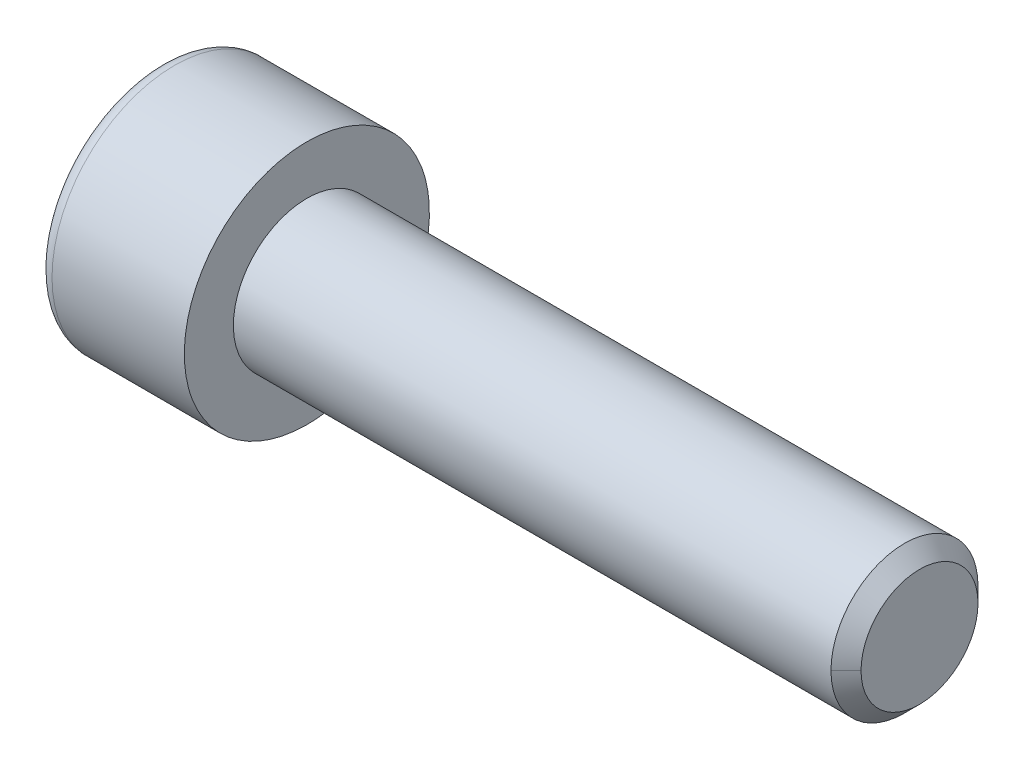
ISO-10303-21;
HEADER;
FILE_DESCRIPTION(('STEP AP214'),'2;1');
FILE_NAME('part.step','',(''),(''),'','','');
FILE_SCHEMA(('AUTOMOTIVE_DESIGN { 1 0 10303 214 1 1 1 1 }'));
ENDSEC;
DATA;
#1=APPLICATION_CONTEXT('core data for automotive mechanical design processes');
#2=APPLICATION_PROTOCOL_DEFINITION('international standard','automotive_design',2000,#1);
#3=PRODUCT_CONTEXT('',#1,'mechanical');
#4=PRODUCT('Part','Part','',(#3));
#5=PRODUCT_RELATED_PRODUCT_CATEGORY('part','',(#4));
#6=PRODUCT_DEFINITION_FORMATION('','',#4);
#7=PRODUCT_DEFINITION_CONTEXT('part definition',#1,'design');
#8=PRODUCT_DEFINITION('design','',#6,#7);
#9=PRODUCT_DEFINITION_SHAPE('','',#8);
#10=(LENGTH_UNIT() NAMED_UNIT(*) SI_UNIT(.MILLI.,.METRE.));
#11=(NAMED_UNIT(*) PLANE_ANGLE_UNIT() SI_UNIT($,.RADIAN.));
#12=(NAMED_UNIT(*) SI_UNIT($,.STERADIAN.) SOLID_ANGLE_UNIT());
#13=UNCERTAINTY_MEASURE_WITH_UNIT(LENGTH_MEASURE(1.E-05),#10,'distance_accuracy_value','');
#14=(GEOMETRIC_REPRESENTATION_CONTEXT(3) GLOBAL_UNCERTAINTY_ASSIGNED_CONTEXT((#13)) GLOBAL_UNIT_ASSIGNED_CONTEXT((#10,
#11,#12)) REPRESENTATION_CONTEXT('',''));
#15=CARTESIAN_POINT('',(0.,0.,0.));
#16=DIRECTION('',(0.,0.,1.));
#17=DIRECTION('',(1.,0.,0.));
#18=AXIS2_PLACEMENT_3D('',#15,#16,#17);
#19=CARTESIAN_POINT('',(25.,-2.4151886,2.4151886));
#20=DIRECTION('',(1.,0.,0.));
#21=DIRECTION('',(0.,1.,0.));
#22=AXIS2_PLACEMENT_3D('',#19,#20,#21);
#23=PLANE('',#22);
#24=CARTESIAN_POINT('',(25.,0.,0.));
#25=DIRECTION('',(1.,0.,0.));
#26=DIRECTION('',(0.,0.,-1.));
#27=AXIS2_PLACEMENT_3D('',#24,#25,#26);
#28=CIRCLE('',#27,2.38655);
#29=CARTESIAN_POINT('',(25.,-8.15815978925537E-10,2.38654999999999));
#30=VERTEX_POINT('',#29);
#31=CARTESIAN_POINT('',(25.,-2.85727898792687E-10,-2.38654999999999));
#32=VERTEX_POINT('',#31);
#33=EDGE_CURVE('E128',#30,#32,#28,.F.);
#34=ORIENTED_EDGE('',*,*,#33,.F.);
#35=CARTESIAN_POINT('',(25.,0.,0.));
#36=DIRECTION('',(1.,0.,0.));
#37=DIRECTION('',(0.,0.,-1.));
#38=AXIS2_PLACEMENT_3D('',#35,#36,#37);
#39=CIRCLE('',#38,2.38655);
#40=EDGE_CURVE('E57',#32,#30,#39,.F.);
#41=ORIENTED_EDGE('',*,*,#40,.F.);
#42=EDGE_LOOP('',(#34,#41));
#43=FACE_BOUND('',#42,.T.);
#44=ADVANCED_FACE('F53',(#43),#23,.T.);
#45=CARTESIAN_POINT('',(25.,0.,-2.38655));
#46=CARTESIAN_POINT('',(24.38655,0.,-3.));
#47=(BOUNDED_CURVE() B_SPLINE_CURVE(1,(#45,#46),.UNSPECIFIED.,.F.,
.F.) B_SPLINE_CURVE_WITH_KNOTS((2,2),(0.,1.00000000000009),
.UNSPECIFIED.) CURVE() GEOMETRIC_REPRESENTATION_ITEM() RATIONAL_B_SPLINE_CURVE((1.,1.)) REPRESENTATION_ITEM(''));
#48=CARTESIAN_POINT('',(1024.38655,0.,0.));
#49=DIRECTION('',(-1.,0.,0.));
#50=AXIS1_PLACEMENT('',#48,#49);
#51=SURFACE_OF_REVOLUTION('',#47,#50);
#52=ORIENTED_EDGE('',*,*,#40,.T.);
#53=DIRECTION('',(0.707106781186548,2.90060050295602E-10,-0.707106781186547));
#54=VECTOR('',#53,1.);
#55=CARTESIAN_POINT('',(24.693275,-1.10479987286926E-09,2.693275));
#56=LINE('',#55,#54);
#57=CARTESIAN_POINT('',(24.38655,-1.23062057109199E-09,3.));
#58=VERTEX_POINT('',#57);
#59=EDGE_CURVE('E125',#58,#30,#56,.T.);
#60=ORIENTED_EDGE('',*,*,#59,.F.);
#61=CARTESIAN_POINT('',(24.38655,0.,0.));
#62=DIRECTION('',(1.,0.,0.));
#63=DIRECTION('',(0.,0.,-1.));
#64=AXIS2_PLACEMENT_3D('',#61,#62,#63);
#65=CIRCLE('',#64,3.);
#66=CARTESIAN_POINT('',(24.38655,-2.69379553018569E-10,-3.));
#67=VERTEX_POINT('',#66);
#68=EDGE_CURVE('E134',#67,#58,#65,.F.);
#69=ORIENTED_EDGE('',*,*,#68,.F.);
#70=DIRECTION('',(-0.707106781186548,-1.26986739101621E-10,-0.707106781186547));
#71=VECTOR('',#70,1.);
#72=CARTESIAN_POINT('',(24.693275,-4.83675477104059E-10,-2.693275));
#73=LINE('',#72,#71);
#74=EDGE_CURVE('E119',#32,#67,#73,.T.);
#75=ORIENTED_EDGE('',*,*,#74,.F.);
#76=EDGE_LOOP('',(#52,#60,#69,#75));
#77=FACE_BOUND('',#76,.T.);
#78=ADVANCED_FACE('F132',(#77),#51,.T.);
#79=CARTESIAN_POINT('',(25.0001414213562,0.,-2.38640857864376));
#80=CARTESIAN_POINT('',(25.,0.,-2.38655));
#81=CARTESIAN_POINT('',(24.38655,0.,-3.));
#82=(BOUNDED_CURVE() B_SPLINE_CURVE(1,(#79,#80,#81),.UNSPECIFIED.,.F.,
.F.) B_SPLINE_CURVE_WITH_KNOTS((2,1,2),(-0.000230534409542768,3.70006775601133E-11,1.),
.UNSPECIFIED.) CURVE() GEOMETRIC_REPRESENTATION_ITEM() RATIONAL_B_SPLINE_CURVE((1.,1.,1.)) REPRESENTATION_ITEM(''));
#83=CARTESIAN_POINT('',(1024.38655,0.,0.));
#84=DIRECTION('',(-1.,0.,0.));
#85=AXIS1_PLACEMENT('',#83,#84);
#86=SURFACE_OF_REVOLUTION('',#82,#85);
#87=ORIENTED_EDGE('',*,*,#59,.T.);
#88=ORIENTED_EDGE('',*,*,#33,.T.);
#89=ORIENTED_EDGE('',*,*,#74,.T.);
#90=CARTESIAN_POINT('',(24.38655,0.,0.));
#91=DIRECTION('',(1.,0.,0.));
#92=DIRECTION('',(0.,0.,-1.));
#93=AXIS2_PLACEMENT_3D('',#90,#91,#92);
#94=CIRCLE('',#93,3.);
#95=EDGE_CURVE('E129',#58,#67,#94,.F.);
#96=ORIENTED_EDGE('',*,*,#95,.F.);
#97=EDGE_LOOP('',(#87,#88,#89,#96));
#98=FACE_BOUND('',#97,.T.);
#99=ADVANCED_FACE('F126',(#98),#86,.T.);
#100=CARTESIAN_POINT('',(-1.333333333,0.,0.));
#101=CARTESIAN_POINT('',(-3.01,0.,-2.904071854));
#102=(BOUNDED_CURVE() B_SPLINE_CURVE(1,(#100,#101),.UNSPECIFIED.,.F.,
.F.) B_SPLINE_CURVE_WITH_KNOTS((2,2),(0.,1.),
.UNSPECIFIED.) CURVE() GEOMETRIC_REPRESENTATION_ITEM() RATIONAL_B_SPLINE_CURVE((1.,1.)) REPRESENTATION_ITEM(''));
#103=CARTESIAN_POINT('',(996.99,0.,0.));
#104=DIRECTION('',(-1.,0.,0.));
#105=AXIS1_PLACEMENT('',#103,#104);
#106=SURFACE_OF_REVOLUTION('',#102,#105);
#107=CARTESIAN_POINT('',(-1.333333333,0.,0.));
#108=VERTEX_POINT('',#107);
#109=VERTEX_LOOP('',#108);
#110=FACE_BOUND('',#109,.T.);
#111=CARTESIAN_POINT('',(-2.99999999990194,-2.5,1.44337567259391));
#112=CARTESIAN_POINT('',(-2.98209574263693,-2.5,1.38134905294953));
#113=CARTESIAN_POINT('',(-2.96498591501795,-2.5,1.31908524854831));
#114=CARTESIAN_POINT('',(-2.9325586063815,-2.5,1.19402341340579));
#115=CARTESIAN_POINT('',(-2.91724304001177,-2.5,1.13122488732653));
#116=CARTESIAN_POINT('',(-2.88864230481174,-2.5,1.00514627159482));
#117=CARTESIAN_POINT('',(-2.87535773971234,-2.5,0.941866044598566));
#118=CARTESIAN_POINT('',(-2.84501155623976,-2.5,0.783295355537952));
#119=CARTESIAN_POINT('',(-2.82935510407788,-2.5,0.687729720023883));
#120=CARTESIAN_POINT('',(-2.8038363929103,-2.5,0.49582792968208));
#121=CARTESIAN_POINT('',(-2.79397345365601,-2.5,0.399491866661438));
#122=CARTESIAN_POINT('',(-2.78132126682311,-2.5,0.217329774455165));
#123=CARTESIAN_POINT('',(-2.77785668029329,-2.5,0.13155078285884));
#124=CARTESIAN_POINT('',(-2.77604418751081,-2.5,-0.0400958904405022));
#125=CARTESIAN_POINT('',(-2.77769824160356,-2.5,-0.125963593529663));
#126=CARTESIAN_POINT('',(-2.78605196619317,-2.5,-0.297450074329791));
#127=CARTESIAN_POINT('',(-2.79275167480722,-2.5,-0.383068850155342));
#128=CARTESIAN_POINT('',(-2.8108998117244,-2.5,-0.553755303851712));
#129=CARTESIAN_POINT('',(-2.82234605098717,-2.5,-0.638823217429646));
#130=CARTESIAN_POINT('',(-2.84954081955049,-2.5,-0.808258474159647));
#131=CARTESIAN_POINT('',(-2.86528928104194,-2.5,-0.892625828331925));
#132=CARTESIAN_POINT('',(-2.90056247218591,-2.5,-1.06053688925276));
#133=CARTESIAN_POINT('',(-2.92008612509887,-2.5,-1.14408082372909));
#134=CARTESIAN_POINT('',(-2.95044571186063,-2.5,-1.26341360873709));
#135=CARTESIAN_POINT('',(-2.95996603514937,-2.5,-1.29954359668296));
#136=CARTESIAN_POINT('',(-2.9795691964924,-2.5,-1.37159959189587));
#137=CARTESIAN_POINT('',(-2.98965127625646,-2.5,-1.40752580531338));
#138=CARTESIAN_POINT('',(-2.99999999995315,-2.5,-1.44337567277131));
#139=B_SPLINE_CURVE_WITH_KNOTS('',3,(#111,#112,#113,#114,#115,#116,#117,#118,#119,#120,#121,
#122,#123,#124,#125,#126,#127,#128,#129,#130,#131,#132,#133,#134,#135,#136,#137,#138),
.UNSPECIFIED.,.F.,.F.,(4,2,2,2,2,2,2,2,2,2,2,2,2,4),(0.,0.193683427773067,0.38757168712609,
0.581517469676064,0.871873940003063,1.16219631114209,1.41959520256128,1.67709268522974,
1.93459211317248,2.1919729174537,2.44934966528471,2.70665311350898,2.81873929256059,
2.93067767377976),.UNSPECIFIED.);
#140=CARTESIAN_POINT('',(-2.99999999985056,-2.49999999997164,1.44337567301637));
#141=VERTEX_POINT('',#140);
#142=CARTESIAN_POINT('',(-2.9999999999511,-2.49999999989483,-1.44337567294638));
#143=VERTEX_POINT('',#142);
#144=EDGE_CURVE('E489',#141,#143,#139,.T.);
#145=ORIENTED_EDGE('',*,*,#144,.F.);
#146=CARTESIAN_POINT('',(-2.99999999981082,-6.92430306305458E-10,2.88675134560023));
#147=CARTESIAN_POINT('',(-2.98209574255005,-0.0537166290131819,2.85573803577872));
#148=CARTESIAN_POINT('',(-2.96498591493549,-0.107638665358749,2.8246061335788));
#149=CARTESIAN_POINT('',(-2.93255860630814,-0.215945391631711,2.76207521600893));
#150=CARTESIAN_POINT('',(-2.9172430399431,-0.270330510534358,2.73067595297002));
#151=CARTESIAN_POINT('',(-2.88864230475259,-0.379517794627478,2.66763664510564));
#152=CARTESIAN_POINT('',(-2.87535773965803,-0.43432007876117,2.63599653160827));
#153=CARTESIAN_POINT('',(-2.84501155619788,-0.571646323777089,2.55671118708011));
#154=CARTESIAN_POINT('',(-2.82935510404371,-0.654408591857143,2.50892836932449));
#155=CARTESIAN_POINT('',(-2.8038363928916,-0.820600417316618,2.41297747415662));
#156=CARTESIAN_POINT('',(-2.79397345364506,-0.904029895188767,2.36480944264792));
#157=CARTESIAN_POINT('',(-2.78132126682574,-1.06178689464532,2.27372839654349));
#158=CARTESIAN_POINT('',(-2.77785668030231,-1.13607368048253,2.23083890074238));
#159=CARTESIAN_POINT('',(-2.7760441875333,-1.28472406004208,2.14501556408699));
#160=CARTESIAN_POINT('',(-2.77769824163313,-1.35908767228535,2.10208171253965));
#161=CARTESIAN_POINT('',(-2.78605196623694,-1.5075993210704,2.01633847213427));
#162=CARTESIAN_POINT('',(-2.79275167485812,-1.58174735597935,1.97352908421893));
#163=CARTESIAN_POINT('',(-2.81089981178956,-1.72956616096821,1.88818585736579));
#164=CARTESIAN_POINT('',(-2.82234605105948,-1.80323713517648,1.84565190057442));
#165=CARTESIAN_POINT('',(-2.84954081963674,-1.94997237180682,1.76093427220477));
#166=CARTESIAN_POINT('',(-2.86528928113499,-2.02303664377268,1.71875059511638));
#167=CARTESIAN_POINT('',(-2.90056247229208,-2.16845188811155,1.63479506465155));
#168=CARTESIAN_POINT('',(-2.92008612521135,-2.2408030577026,1.59302309741122));
#169=CARTESIAN_POINT('',(-2.95044571196894,-2.34414828098353,1.53335670492944));
#170=CARTESIAN_POINT('',(-2.95996603524654,-2.37543776834049,1.51529171098077));
#171=CARTESIAN_POINT('',(-2.9795691965657,-2.43784009060514,1.47926371342257));
#172=CARTESIAN_POINT('',(-2.98965127631702,-2.46895310404436,1.46130060673781));
#173=CARTESIAN_POINT('',(-3.00000000000026,-2.49999999994328,1.44337567303274));
#174=B_SPLINE_CURVE_WITH_KNOTS('',3,(#146,#147,#148,#149,#150,#151,#152,#153,#154,#155,#156,
#157,#158,#159,#160,#161,#162,#163,#164,#165,#166,#167,#168,#169,#170,#171,#172,#173),
.UNSPECIFIED.,.F.,.F.,(4,2,2,2,2,2,2,2,2,2,2,2,2,4),(0.,0.193683427763163,0.387571687106229,
0.581517469646224,0.871873939957275,1.16219631108039,1.41959520251302,1.67709268519497,
1.93459211315123,2.19197291744619,2.44934966529089,2.70665311352883,2.8187392924298,
2.93067767349862),.UNSPECIFIED.);
#175=CARTESIAN_POINT('',(-3.00000000004163,-1.18416519667169E-09,2.886751346));
#176=VERTEX_POINT('',#175);
#177=EDGE_CURVE('E140',#176,#141,#174,.T.);
#178=ORIENTED_EDGE('',*,*,#177,.F.);
#179=CARTESIAN_POINT('',(-3.00000000004014,2.50000000006292,1.44337567296367));
#180=CARTESIAN_POINT('',(-2.98209574277019,2.44628337173678,1.47438898278829));
#181=CARTESIAN_POINT('',(-2.96498591514619,2.39236133538579,1.50552088499134));
#182=CARTESIAN_POINT('',(-2.93255860649956,2.28405460910186,1.56805180256754));
#183=CARTESIAN_POINT('',(-2.91724304012469,2.22966949019366,1.59945106560966));
#184=CARTESIAN_POINT('',(-2.88864230491419,2.12048220608924,1.66249037348057));
#185=CARTESIAN_POINT('',(-2.87535773980948,2.0656799219498,1.69413048698125));
#186=CARTESIAN_POINT('',(-2.8450115563234,1.92835367691897,1.77341583151802));
#187=CARTESIAN_POINT('',(-2.82935510415318,1.84559140882962,1.82119864927901));
#188=CARTESIAN_POINT('',(-2.80383639296923,1.67939958335076,1.91714954445807));
#189=CARTESIAN_POINT('',(-2.7939734537069,1.59597010546853,1.96531757597259));
#190=CARTESIAN_POINT('',(-2.78132126685985,1.43821310600813,2.05639862207924));
#191=CARTESIAN_POINT('',(-2.77785668032333,1.36392632017731,2.09928811787666));
#192=CARTESIAN_POINT('',(-2.77604418752705,1.21527594062986,2.18511145452507));
#193=CARTESIAN_POINT('',(-2.7776982416127,1.14091232839229,2.22804530606911));
#194=CARTESIAN_POINT('',(-2.78605196618806,0.992400679617963,2.31378854646831));
#195=CARTESIAN_POINT('',(-2.79275167479497,0.918252644714026,2.35659793438075));
#196=CARTESIAN_POINT('',(-2.81089981169805,0.77043383973447,2.44194116122851));
#197=CARTESIAN_POINT('',(-2.82234605095387,0.696762865530502,2.4844751180174));
#198=CARTESIAN_POINT('',(-2.84954081950371,0.55002762890825,2.56919274638238));
#199=CARTESIAN_POINT('',(-2.86528928098864,0.476963356946185,2.61137642346858));
#200=CARTESIAN_POINT('',(-2.90056247212028,0.331548112614633,2.69533195392919));
#201=CARTESIAN_POINT('',(-2.92008612502744,0.259196943027112,2.73710392116748));
#202=CARTESIAN_POINT('',(-2.95044571181407,0.155851719595239,2.79677031373641));
#203=CARTESIAN_POINT('',(-2.95996603513553,0.124562232084562,2.81483530777383));
#204=CARTESIAN_POINT('',(-2.97956919654802,0.0621599095141735,2.85086330550854));
#205=CARTESIAN_POINT('',(-2.98965127634881,0.0310468959229215,2.86882641228108));
#206=CARTESIAN_POINT('',(-3.00000000008409,-1.27376694826501E-10,2.88675134607354));
#207=B_SPLINE_CURVE_WITH_KNOTS('',3,(#179,#180,#181,#182,#183,#184,#185,#186,#187,#188,#189,
#190,#191,#192,#193,#194,#195,#196,#197,#198,#199,#200,#201,#202,#203,#204,#205,#206),
.UNSPECIFIED.,.F.,.F.,(4,2,2,2,2,2,2,2,2,2,2,2,2,4),(0.,0.193683427788764,0.387571687157534,
0.581517469723277,0.87187394007394,1.16219631123659,1.41959520264876,1.67709268531015,
1.93459211324574,2.19197291752029,2.44934966534468,2.70665311356242,2.81873929301174,
2.93067767462766),.UNSPECIFIED.);
#208=CARTESIAN_POINT('',(-2.9999999999511,2.50000000003146,1.44337567270972));
#209=VERTEX_POINT('',#208);
#210=EDGE_CURVE('E142',#209,#176,#207,.T.);
#211=ORIENTED_EDGE('',*,*,#210,.F.);
#212=CARTESIAN_POINT('',(-2.99999999999303,2.5,-1.44337567290945));
#213=CARTESIAN_POINT('',(-2.98209574272447,2.5,-1.38134905326268));
#214=CARTESIAN_POINT('',(-2.96498591510176,2.5,-1.31908524885907));
#215=CARTESIAN_POINT('',(-2.93255860645764,2.5,-1.19402341371172));
#216=CARTESIAN_POINT('',(-2.91724304008399,2.5,-1.13122488763002));
#217=CARTESIAN_POINT('',(-2.88864230487602,2.5,-1.00514627189332));
#218=CARTESIAN_POINT('',(-2.87535773977261,2.5,-0.94186604489453));
#219=CARTESIAN_POINT('',(-2.84501155628974,2.5,-0.783295355827017));
#220=CARTESIAN_POINT('',(-2.82935510412148,2.5,-0.687729720308527));
#221=CARTESIAN_POINT('',(-2.80383639294123,2.5,-0.495827929957529));
#222=CARTESIAN_POINT('',(-2.79397345368064,2.5,-0.399491866932111));
#223=CARTESIAN_POINT('',(-2.78132126683661,2.5,-0.217329774723812));
#224=CARTESIAN_POINT('',(-2.7778566803015,2.5,-0.131550783130307));
#225=CARTESIAN_POINT('',(-2.77604418750818,2.5,0.0400958901637057));
#226=CARTESIAN_POINT('',(-2.77769824159537,2.5,0.125963593250358));
#227=CARTESIAN_POINT('',(-2.7860519661738,2.5,0.29745007404579));
#228=CARTESIAN_POINT('',(-2.79275167478224,2.5,0.383068849869153));
#229=CARTESIAN_POINT('',(-2.81089981168823,2.5,0.553755303561258));
#230=CARTESIAN_POINT('',(-2.82234605094543,2.5,0.638823217137117));
#231=CARTESIAN_POINT('',(-2.84954081949781,2.5,0.808258473863209));
#232=CARTESIAN_POINT('',(-2.8652892809839,2.5,0.892625828033653));
#233=CARTESIAN_POINT('',(-2.90056247211773,2.5,1.06053688895091));
#234=CARTESIAN_POINT('',(-2.9200861250259,2.5,1.14408082342549));
#235=CARTESIAN_POINT('',(-2.95044571178066,2.5,1.26341360843007));
#236=CARTESIAN_POINT('',(-2.95996603506711,2.5,1.29954359637421));
#237=CARTESIAN_POINT('',(-2.97956919640564,2.5,1.37159959158371));
#238=CARTESIAN_POINT('',(-2.9896512761675,2.5,1.40752580499953));
#239=CARTESIAN_POINT('',(-2.99999999986206,2.5,1.44337567245577));
#240=B_SPLINE_CURVE_WITH_KNOTS('',3,(#212,#213,#214,#215,#216,#217,#218,#219,#220,#221,#222,
#223,#224,#225,#226,#227,#228,#229,#230,#231,#232,#233,#234,#235,#236,#237,#238,#239),
.UNSPECIFIED.,.F.,.F.,(4,2,2,2,2,2,2,2,2,2,2,2,2,4),(0.,0.193683427782941,0.387571687145881,
0.581517469705791,0.871873940048986,1.16219631120418,1.41959520261558,1.6770926852762,
1.93459211321108,2.19197291748389,2.44934966530652,2.70665311352239,2.81873929256726,
2.93067767377976),.UNSPECIFIED.);
#241=CARTESIAN_POINT('',(-2.9999999999511,2.49999999983501,-1.44337567304999));
#242=VERTEX_POINT('',#241);
#243=EDGE_CURVE('E521',#242,#209,#240,.T.);
#244=ORIENTED_EDGE('',*,*,#243,.F.);
#245=CARTESIAN_POINT('',(-2.99999999997736,1.9280147525356E-10,-2.88675134588869));
#246=CARTESIAN_POINT('',(-2.98209574271006,0.05371662851739,-2.85573803606497));
#247=CARTESIAN_POINT('',(-2.96498591508868,0.107638664866787,-2.82460613386283));
#248=CARTESIAN_POINT('',(-2.93255860644731,0.215945391147497,-2.76207521628849));
#249=CARTESIAN_POINT('',(-2.91724304007509,0.27033051005406,-2.73067595324732));
#250=CARTESIAN_POINT('',(-2.88864230487006,0.379517794155173,-2.66763664537832));
#251=CARTESIAN_POINT('',(-2.87535773976816,0.434320078292939,-2.63599653187861));
#252=CARTESIAN_POINT('',(-2.8450115562892,0.57164632331975,-2.55671118734415));
#253=CARTESIAN_POINT('',(-2.82935510412338,0.65440859140672,-2.50892836958454));
#254=CARTESIAN_POINT('',(-2.80383639294808,0.820600416880588,-2.41297747440836));
#255=CARTESIAN_POINT('',(-2.79397345369,0.904029894760213,-2.36480944289534));
#256=CARTESIAN_POINT('',(-2.78132126685048,1.06178689421983,-2.27372839678915));
#257=CARTESIAN_POINT('',(-2.77785668031755,1.13607368005252,-2.23083890099064));
#258=CARTESIAN_POINT('',(-2.77604418752874,1.28472405960351,-2.1450155643402));
#259=CARTESIAN_POINT('',(-2.77769824161827,1.35908767184276,-2.10208171279518));
#260=CARTESIAN_POINT('',(-2.78605196620148,1.50759932062025,-2.01633847239416));
#261=CARTESIAN_POINT('',(-2.79275167481235,1.58174735552568,-1.97352908448086));
#262=CARTESIAN_POINT('',(-2.81089981172326,1.7295661605078,-1.88818585763161));
#263=CARTESIAN_POINT('',(-2.82234605098294,1.80323713471284,-1.84565190084211));
#264=CARTESIAN_POINT('',(-2.8495408195403,1.94997237133708,-1.76093427247597));
#265=CARTESIAN_POINT('',(-2.86528928102888,2.02303664330007,-1.71875059538924));
#266=CARTESIAN_POINT('',(-2.90056247216742,2.1684518876334,-1.63479506492761));
#267=CARTESIAN_POINT('',(-2.92008612507781,2.24080305722177,-1.59302309768883));
#268=CARTESIAN_POINT('',(-2.95044571183394,2.34414828053542,-1.53335670518816));
#269=CARTESIAN_POINT('',(-2.95996603511936,2.37543776792759,-1.51529171121916));
#270=CARTESIAN_POINT('',(-2.97956919645556,2.4378400902623,-1.47926371362051));
#271=CARTESIAN_POINT('',(-2.9896512762161,2.46895310373638,-1.46130060691562));
#272=CARTESIAN_POINT('',(-2.99999999990917,2.49999999967002,-1.44337567319052));
#273=B_SPLINE_CURVE_WITH_KNOTS('',3,(#245,#246,#247,#248,#249,#250,#251,#252,#253,#254,#255,
#256,#257,#258,#259,#260,#261,#262,#263,#264,#265,#266,#267,#268,#269,#270,#271,#272),
.UNSPECIFIED.,.F.,.F.,(4,2,2,2,2,2,2,2,2,2,2,2,2,4),(0.,0.193683427781386,0.387571687142756,
0.581517469701091,0.871873940041472,1.16219631119386,1.41959520261202,1.67709268527943,
1.93459211322111,2.19197291750089,2.44934966533046,2.70665311355327,2.81873929257813,
2.93067767377066),.UNSPECIFIED.);
#274=CARTESIAN_POINT('',(-3.0000000000959,-1.62810287944994E-10,-2.886751346094));
#275=VERTEX_POINT('',#274);
#276=EDGE_CURVE('E511',#275,#242,#273,.T.);
#277=ORIENTED_EDGE('',*,*,#276,.F.);
#278=CARTESIAN_POINT('',(-2.99999999994905,-2.49999999978965,-1.44337567312145));
#279=CARTESIAN_POINT('',(-2.98209574268285,-2.44628337146572,-1.47438898294478));
#280=CARTESIAN_POINT('',(-2.96498591506263,-2.39236133511698,-1.50552088514654));
#281=CARTESIAN_POINT('',(-2.93255860642365,-2.2840546088376,-1.56805180272011));
#282=CARTESIAN_POINT('',(-2.91724304005265,-2.22966948993171,-1.5994510657609));
#283=CARTESIAN_POINT('',(-2.88864230485011,-2.12048220583196,-1.66249037362911));
#284=CARTESIAN_POINT('',(-2.87535773974946,-2.06567992169489,-1.69413048712842));
#285=CARTESIAN_POINT('',(-2.84501155627371,-1.92835367666992,-1.77341583166181));
#286=CARTESIAN_POINT('',(-2.82935510410985,-1.84559140858412,-1.82119864942075));
#287=CARTESIAN_POINT('',(-2.80383639293848,-1.67939958311269,-1.91714954459552));
#288=CARTESIAN_POINT('',(-2.79397345368236,-1.59597010523433,-1.96531757610781));
#289=CARTESIAN_POINT('',(-2.78132126684628,-1.43821310577522,-2.05639862221371));
#290=CARTESIAN_POINT('',(-2.77785668031497,-1.36392631994176,-2.09928811801266));
#291=CARTESIAN_POINT('',(-2.77604418752952,-1.2152759403893,-2.18511145466395));
#292=CARTESIAN_POINT('',(-2.77769824162078,-1.14091232814936,-2.22804530620937));
#293=CARTESIAN_POINT('',(-2.78605196620749,-0.992400679370574,-2.31378854661114));
#294=CARTESIAN_POINT('',(-2.79275167482015,-0.918252644464542,-2.35659793452478));
#295=CARTESIAN_POINT('',(-2.81089981173457,-0.770433839481277,-2.44194116137469));
#296=CARTESIAN_POINT('',(-2.82234605099598,-0.696762865275693,-2.48447511816451));
#297=CARTESIAN_POINT('',(-2.8495408195567,-0.550027628650418,-2.56919274653124));
#298=CARTESIAN_POINT('',(-2.86528928104691,-0.476963356686943,-2.61137642361826));
#299=CARTESIAN_POINT('',(-2.90056247218859,-0.331548112352686,-2.69533195408042));
#300=CARTESIAN_POINT('',(-2.9200861251005,-0.259196942763867,-2.73710392131946));
#301=CARTESIAN_POINT('',(-2.95044571185584,-0.155851719459382,-2.79677031381484));
#302=CARTESIAN_POINT('',(-2.95996603513881,-0.124562232076772,-2.81483530777832));
#303=CARTESIAN_POINT('',(-2.97956919646974,-0.0621599097610845,-2.85086330536599));
#304=CARTESIAN_POINT('',(-2.98965127622746,-0.0310468962964689,-2.86882641206541));
#305=CARTESIAN_POINT('',(-2.99999999991754,-3.72252951759761E-10,-2.88675134578508));
#306=B_SPLINE_CURVE_WITH_KNOTS('',3,(#278,#279,#280,#281,#282,#283,#284,#285,#286,#287,#288,
#289,#290,#291,#292,#293,#294,#295,#296,#297,#298,#299,#300,#301,#302,#303,#304,#305),
.UNSPECIFIED.,.F.,.F.,(4,2,2,2,2,2,2,2,2,2,2,2,2,4),(0.,0.193683427778269,0.387571687136511,
0.581517469691713,0.871873940027135,1.16219631117457,1.41959520259521,1.67709268526511,
1.93459211320929,2.19197291749163,2.44934966532376,2.70665311354912,2.81873929254008,
2.93067767369877),.UNSPECIFIED.);
#307=EDGE_CURVE('E499',#143,#275,#306,.T.);
#308=ORIENTED_EDGE('',*,*,#307,.F.);
#309=EDGE_LOOP('',(#145,#178,#211,#244,#277,#308));
#310=FACE_BOUND('',#309,.T.);
#311=ADVANCED_FACE('F160',(#110,#310),#106,.F.);
#312=CARTESIAN_POINT('',(0.,3.,0.));
#313=CARTESIAN_POINT('',(24.38655,3.,0.));
#314=(BOUNDED_CURVE() B_SPLINE_CURVE(1,(#312,#313),.UNSPECIFIED.,.F.,
.F.) B_SPLINE_CURVE_WITH_KNOTS((2,2),(0.,1.),
.UNSPECIFIED.) CURVE() GEOMETRIC_REPRESENTATION_ITEM() RATIONAL_B_SPLINE_CURVE((1.,1.)) REPRESENTATION_ITEM(''));
#315=CARTESIAN_POINT('',(14.,0.,0.));
#316=DIRECTION('',(1.,0.,0.));
#317=AXIS1_PLACEMENT('',#315,#316);
#318=SURFACE_OF_REVOLUTION('',#314,#317);
#319=CARTESIAN_POINT('',(0.,3.,1.79585082180927E-10));
#320=CARTESIAN_POINT('',(0.,2.99999949522854,0.0842305921750378));
#321=CARTESIAN_POINT('',(0.,2.99644943210249,0.168476663816767));
#322=CARTESIAN_POINT('',(0.,2.98227226002267,0.336386615205739));
#323=CARTESIAN_POINT('',(0.,2.97164306170328,0.420050315701042));
#324=CARTESIAN_POINT('',(0.,2.9433554403765,0.586325719994559));
#325=CARTESIAN_POINT('',(0.,2.92568585927662,0.668935538006743));
#326=CARTESIAN_POINT('',(0.,2.88343927181851,0.832418927670488));
#327=CARTESIAN_POINT('',(0.,2.85885666003996,0.913291032780675));
#328=CARTESIAN_POINT('',(0.,2.77507914668652,1.15208821042353));
#329=CARTESIAN_POINT('',(0.,2.70578575357263,1.30659602074704));
#330=CARTESIAN_POINT('',(0.,2.54220609659893,1.60176804528835));
#331=CARTESIAN_POINT('',(0.,2.44791888265401,1.7424317329735));
#332=CARTESIAN_POINT('',(0.,2.2898892514552,1.9399880430317));
#333=CARTESIAN_POINT('',(0.,2.23440451662689,2.00363749105151));
#334=CARTESIAN_POINT('',(0.,2.11831409184965,2.12599212156537));
#335=CARTESIAN_POINT('',(0.,2.05771339085062,2.18470201190841));
#336=CARTESIAN_POINT('',(0.,1.93175254690532,2.29683361022014));
#337=CARTESIAN_POINT('',(0.,1.86639026040711,2.35025291063919));
#338=CARTESIAN_POINT('',(0.,1.7314038327038,2.45140072832907));
#339=CARTESIAN_POINT('',(0.,1.6617787079112,2.49912792468452));
#340=CARTESIAN_POINT('',(0.,1.44726826368351,2.63320682475734));
#341=CARTESIAN_POINT('',(0.,1.29661475805599,2.71057412209261));
#342=CARTESIAN_POINT('',(0.,0.984538397769613,2.83887092032264));
#343=CARTESIAN_POINT('',(0.,0.823115658151992,2.88980070358241));
#344=CARTESIAN_POINT('',(0.,0.493990143211312,2.96385049100085));
#345=CARTESIAN_POINT('',(0.,0.326287334354949,2.98697034664271));
#346=CARTESIAN_POINT('',(0.,-0.0106192603936318,3.00472003813866));
#347=CARTESIAN_POINT('',(0.,-0.17982304628585,2.99934987399276));
#348=CARTESIAN_POINT('',(0.,-0.514907479752218,2.96029352943515));
#349=CARTESIAN_POINT('',(0.,-0.680788145068337,2.92660750024165));
#350=CARTESIAN_POINT('',(0.,-1.00461791765848,2.83181297787941));
#351=CARTESIAN_POINT('',(0.,-1.16256694019818,2.77070419182062));
#352=CARTESIAN_POINT('',(0.,-1.38997847831572,2.65990764648401));
#353=CARTESIAN_POINT('',(0.,-1.4642331937897,2.61976066024325));
#354=CARTESIAN_POINT('',(0.,-1.60910065479403,2.533356751595));
#355=CARTESIAN_POINT('',(0.,-1.67971423966904,2.48710124614281));
#356=CARTESIAN_POINT('',(0.,-1.81676022403913,2.38882598111958));
#357=CARTESIAN_POINT('',(0.,-1.88319450224164,2.33680884100812));
#358=CARTESIAN_POINT('',(0.,-2.01149891436324,2.22732998385631));
#359=CARTESIAN_POINT('',(0.,-2.07336458163727,2.16986306080548));
#360=CARTESIAN_POINT('',(0.,-2.25127799284035,1.99000567815265));
#361=CARTESIAN_POINT('',(0.,-2.35982375483851,1.86002810586064));
#362=CARTESIAN_POINT('',(0.,-2.55351363036695,1.58367858014144));
#363=CARTESIAN_POINT('',(0.,-2.63865863339631,1.43730725016412));
#364=CARTESIAN_POINT('',(0.,-2.74706444478656,1.20863511838851));
#365=CARTESIAN_POINT('',(0.,-2.78000876483221,1.13079377999063));
#366=CARTESIAN_POINT('',(0.,-2.83919981745005,0.972654562407022));
#367=CARTESIAN_POINT('',(0.,-2.86545197031175,0.892358730644588));
#368=CARTESIAN_POINT('',(0.,-2.91105470876429,0.729976188975372));
#369=CARTESIAN_POINT('',(0.,-2.93041619252482,0.647892526873583));
#370=CARTESIAN_POINT('',(0.,-2.96215834911786,0.482401803634151));
#371=CARTESIAN_POINT('',(0.,-2.97454108091422,0.398995140300326));
#372=CARTESIAN_POINT('',(0.,-2.98892380783833,0.262882669770961));
#373=CARTESIAN_POINT('',(0.,-2.99307606546448,0.210394788269591));
#374=CARTESIAN_POINT('',(0.,-2.99861431926428,0.105273286690342));
#375=CARTESIAN_POINT('',(0.,-3.00000031543792,0.0526396666124634));
#376=CARTESIAN_POINT('',(0.,-2.99999949525662,-0.08423059117464));
#377=CARTESIAN_POINT('',(0.,-2.99644943215868,-0.168476662817318));
#378=CARTESIAN_POINT('',(0.,-2.98227226013492,-0.336386614210605));
#379=CARTESIAN_POINT('',(0.,-2.97164306184346,-0.420050314709274));
#380=CARTESIAN_POINT('',(0.,-2.94335544057218,-0.586325719012307));
#381=CARTESIAN_POINT('',(0.,-2.92568585949981,-0.668935537030642));
#382=CARTESIAN_POINT('',(0.,-2.88343927209611,-0.832418926708934));
#383=CARTESIAN_POINT('',(0.,-2.85885666034446,-0.913291031827523));
#384=CARTESIAN_POINT('',(0.,-2.77507914707055,-1.15208820949849));
#385=CARTESIAN_POINT('',(0.,-2.70578575400817,-1.30659601984509));
#386=CARTESIAN_POINT('',(0.,-2.54220609713286,-1.60176804444093));
#387=CARTESIAN_POINT('',(0.,-2.44791888323482,-1.74243173215752));
#388=CARTESIAN_POINT('',(0.,-2.28988925210187,-1.93998804226839));
#389=CARTESIAN_POINT('',(0.,-2.23440451729478,-2.00363749030669));
#390=CARTESIAN_POINT('',(0.,-2.11831409255835,-2.12599212085923));
#391=CARTESIAN_POINT('',(0.,-2.0577133915789,-2.18470201122247));
#392=CARTESIAN_POINT('',(0.,-1.93175254767098,-2.29683360957618));
#393=CARTESIAN_POINT('',(0.,-1.86639026119057,-2.35025291001703));
#394=CARTESIAN_POINT('',(0.,-1.73140383352095,-2.45140072775192));
#395=CARTESIAN_POINT('',(0.,-1.66177870874426,-2.49912792413059));
#396=CARTESIAN_POINT('',(0.,-1.44726826456124,-2.63320682427492));
#397=CARTESIAN_POINT('',(0.,-1.2966147589595,-2.71057412166041));
#398=CARTESIAN_POINT('',(0.,-0.984538398715893,-2.83887091999447));
#399=CARTESIAN_POINT('',(0.,-0.823115659115253,-2.88980070330804));
#400=CARTESIAN_POINT('',(0.,-0.493990144199262,-2.96385049083619));
#401=CARTESIAN_POINT('',(0.,-0.326287335350607,-2.98697034653395));
#402=CARTESIAN_POINT('',(0.,0.0106192593920573,-3.0047200381422));
#403=CARTESIAN_POINT('',(0.,0.179823045286067,-2.99934987405271));
#404=CARTESIAN_POINT('',(0.,0.51490747876546,-2.96029352960678));
#405=CARTESIAN_POINT('',(0.,0.680788144092813,-2.92660750046858));
#406=CARTESIAN_POINT('',(0.,1.00461791671455,-2.83181297821428));
#407=CARTESIAN_POINT('',(0.,1.16256693927462,-2.77070419220814));
#408=CARTESIAN_POINT('',(0.,1.38997847742907,-2.65990764694734));
#409=CARTESIAN_POINT('',(0.,1.46423319291642,-2.61976066073134));
#410=CARTESIAN_POINT('',(0.,1.60910065394954,-2.53335675213139));
#411=CARTESIAN_POINT('',(0.,1.67971423883995,-2.48710124670275));
#412=CARTESIAN_POINT('',(0.,1.8167602232428,-2.38882598172521));
#413=CARTESIAN_POINT('',(0.,1.88319450146267,-2.33680884163588));
#414=CARTESIAN_POINT('',(0.,2.01149891362077,-2.22732998452683));
#415=CARTESIAN_POINT('',(0.,2.07336458091398,-2.16986306149661));
#416=CARTESIAN_POINT('',(0.,2.25127799217701,-1.99000567890308));
#417=CARTESIAN_POINT('',(0.,2.35982375421849,-1.86002810664727));
#418=CARTESIAN_POINT('',(0.,2.55351362983904,-1.58367858099263));
#419=CARTESIAN_POINT('',(0.,2.63865863291721,-1.43730725104369));
#420=CARTESIAN_POINT('',(0.,2.74706444438359,-1.20863511930439));
#421=CARTESIAN_POINT('',(0.,2.78000876445511,-1.13079378091769));
#422=CARTESIAN_POINT('',(0.,2.83919981712553,-0.972654563354269));
#423=CARTESIAN_POINT('',(0.,2.86545197001395,-0.892358731600842));
#424=CARTESIAN_POINT('',(0.,2.91105470852067,-0.729976189946921));
#425=CARTESIAN_POINT('',(0.,2.93041619230863,-0.647892527851415));
#426=CARTESIAN_POINT('',(0.,2.96215834895697,-0.482401804622164));
#427=CARTESIAN_POINT('',(0.,2.97454108078118,-0.398995141292236));
#428=CARTESIAN_POINT('',(0.,2.98892380778573,-0.262882670435773));
#429=CARTESIAN_POINT('',(0.,2.99307606544695,-0.210394788602459));
#430=CARTESIAN_POINT('',(0.,2.99861431928182,-0.105273286357475));
#431=CARTESIAN_POINT('',(0.,3.00000031545547,-0.0526396659458053));
#432=CARTESIAN_POINT('',(0.,3.,1.79585082180927E-10));
#433=B_SPLINE_CURVE_WITH_KNOTS('',3,(#319,#320,#321,#322,#323,#324,#325,#326,#327,#328,#329,
#330,#331,#332,#333,#334,#335,#336,#337,#338,#339,#340,#341,#342,#343,#344,#345,#346,#347,#348,
#349,#350,#351,#352,#353,#354,#355,#356,#357,#358,#359,#360,#361,#362,#363,#364,#365,#366,#367,
#368,#369,#370,#371,#372,#373,#374,#375,#376,#377,#378,#379,#380,#381,#382,#383,#384,#385,#386,
#387,#388,#389,#390,#391,#392,#393,#394,#395,#396,#397,#398,#399,#400,#401,#402,#403,#404,#405,
#406,#407,#408,#409,#410,#411,#412,#413,#414,#415,#416,#417,#418,#419,#420,#421,#422,#423,#424,
#425,#426,#427,#428,#429,#430,#431,#432),.UNSPECIFIED.,.T.,.F.,(4,2,2,2,2,2,2,2,2,2,2,2,2,2,2,2,
2,2,2,2,2,2,2,2,2,2,2,2,2,2,2,2,2,2,2,2,2,2,2,2,2,2,2,2,2,2,2,2,2,2,2,2,2,2,2,2,4),(0.,
0.252643316184543,0.505361231639865,0.758481275542631,1.01180715618274,1.51725134291917,
2.02271474576027,2.27577762012549,2.52859650376464,2.78152991223796,3.03452190295018,
3.53997839705089,4.04542949252892,4.55088328731834,5.05633708210776,5.56178817758577,
6.0672446716865,6.32023666239877,6.57317007087212,6.82598895451123,7.07905182887641,
7.58451523171754,8.08995941845395,8.34328529909469,8.59640534299822,8.84912325845305,
9.10176657463668,9.25965528719948,9.41754399976228,9.67018731594591,9.92290523140074,
10.1760252753043,10.429351155945,10.9347953426814,11.4402587455226,11.6933216198877,
11.9461405035268,12.1990739120002,12.4520659027125,12.9575223968132,13.4629734922912,
13.9684272870806,14.47388108187,14.9793321773481,15.4847886714488,15.737780662161,
15.9907140706343,16.2435329542735,16.4965958286387,17.0020592314798,17.5075034182162,
17.7608292988563,18.0139493427591,18.2666672582144,18.519310574399,18.6771992879614,
18.8350880015239),.UNSPECIFIED.);
#434=CARTESIAN_POINT('',(0.,3.,1.79585082180927E-10));
#435=VERTEX_POINT('',#434);
#436=EDGE_CURVE('E476',#435,#435,#433,.T.);
#437=ORIENTED_EDGE('',*,*,#436,.T.);
#438=EDGE_LOOP('',(#437));
#439=FACE_BOUND('',#438,.T.);
#440=ORIENTED_EDGE('',*,*,#68,.T.);
#441=ORIENTED_EDGE('',*,*,#95,.T.);
#442=EDGE_LOOP('',(#440,#441));
#443=FACE_BOUND('',#442,.T.);
#444=ADVANCED_FACE('F139',(#439,#443),#318,.T.);
#445=CARTESIAN_POINT('',(-6.,-2.5,1.443375673));
#446=DIRECTION('',(0.,-0.500000000006738,0.866025403780548));
#447=DIRECTION('',(0.,0.866025403780548,0.500000000006738));
#448=AXIS2_PLACEMENT_3D('',#445,#446,#447);
#449=PLANE('',#448);
#450=DIRECTION('',(0.,0.866025403780548,0.500000000006738));
#451=VECTOR('',#450,1.);
#452=CARTESIAN_POINT('',(-6.,-2.50000000332919,1.44337567107789));
#453=LINE('',#452,#451);
#454=CARTESIAN_POINT('',(-6.,-2.5,1.443375673));
#455=VERTEX_POINT('',#454);
#456=CARTESIAN_POINT('',(-6.,0.,2.886751346));
#457=VERTEX_POINT('',#456);
#458=EDGE_CURVE('E483',#455,#457,#453,.T.);
#459=ORIENTED_EDGE('',*,*,#458,.T.);
#460=DIRECTION('',(1.,0.,0.));
#461=VECTOR('',#460,1.);
#462=CARTESIAN_POINT('',(-6.,0.,2.886751346));
#463=LINE('',#462,#461);
#464=EDGE_CURVE('E527',#176,#457,#463,.F.);
#465=ORIENTED_EDGE('',*,*,#464,.F.);
#466=ORIENTED_EDGE('',*,*,#177,.T.);
#467=DIRECTION('',(1.,0.,0.));
#468=VECTOR('',#467,1.);
#469=CARTESIAN_POINT('',(-6.,-2.5,1.443375673));
#470=LINE('',#469,#468);
#471=EDGE_CURVE('E484',#455,#141,#470,.T.);
#472=ORIENTED_EDGE('',*,*,#471,.F.);
#473=EDGE_LOOP('',(#459,#465,#466,#472));
#474=FACE_BOUND('',#473,.T.);
#475=ADVANCED_FACE('F157',(#474),#449,.F.);
#476=CARTESIAN_POINT('',(-6.,0.,2.886751346));
#477=DIRECTION('',(0.,0.500000000006738,0.866025403780548));
#478=DIRECTION('',(0.,0.866025403780548,-0.500000000006738));
#479=AXIS2_PLACEMENT_3D('',#476,#477,#478);
#480=PLANE('',#479);
#481=DIRECTION('',(0.,0.866025403780548,-0.500000000006738));
#482=VECTOR('',#481,1.);
#483=CARTESIAN_POINT('',(-6.,3.35008062957165E-10,2.88675134580658));
#484=LINE('',#483,#482);
#485=CARTESIAN_POINT('',(-6.,2.5,1.443375673));
#486=VERTEX_POINT('',#485);
#487=EDGE_CURVE('E539',#457,#486,#484,.T.);
#488=ORIENTED_EDGE('',*,*,#487,.T.);
#489=DIRECTION('',(1.,0.,0.));
#490=VECTOR('',#489,1.);
#491=CARTESIAN_POINT('',(-6.,2.5,1.443375673));
#492=LINE('',#491,#490);
#493=EDGE_CURVE('E518',#209,#486,#492,.F.);
#494=ORIENTED_EDGE('',*,*,#493,.F.);
#495=ORIENTED_EDGE('',*,*,#210,.T.);
#496=ORIENTED_EDGE('',*,*,#464,.T.);
#497=EDGE_LOOP('',(#488,#494,#495,#496));
#498=FACE_BOUND('',#497,.T.);
#499=ADVANCED_FACE('F232',(#498),#480,.F.);
#500=CARTESIAN_POINT('',(-6.,2.5,1.443375673));
#501=DIRECTION('',(0.,1.,0.));
#502=DIRECTION('',(0.,0.,-1.));
#503=AXIS2_PLACEMENT_3D('',#500,#501,#502);
#504=PLANE('',#503);
#505=DIRECTION('',(0.,0.,-1.));
#506=VECTOR('',#505,1.);
#507=CARTESIAN_POINT('',(-6.,2.5,4.452851156));
#508=LINE('',#507,#506);
#509=CARTESIAN_POINT('',(-6.,2.5,-1.443375673));
#510=VERTEX_POINT('',#509);
#511=EDGE_CURVE('E540',#486,#510,#508,.T.);
#512=ORIENTED_EDGE('',*,*,#511,.T.);
#513=DIRECTION('',(1.,0.,0.));
#514=VECTOR('',#513,1.);
#515=CARTESIAN_POINT('',(-6.,2.5,-1.443375673));
#516=LINE('',#515,#514);
#517=EDGE_CURVE('E506',#242,#510,#516,.F.);
#518=ORIENTED_EDGE('',*,*,#517,.F.);
#519=ORIENTED_EDGE('',*,*,#243,.T.);
#520=ORIENTED_EDGE('',*,*,#493,.T.);
#521=EDGE_LOOP('',(#512,#518,#519,#520));
#522=FACE_BOUND('',#521,.T.);
#523=ADVANCED_FACE('F240',(#522),#504,.F.);
#524=CARTESIAN_POINT('',(-6.,2.5,-1.443375673));
#525=DIRECTION('',(0.,0.500000000006738,-0.866025403780548));
#526=DIRECTION('',(0.,-0.866025403780548,-0.500000000006738));
#527=AXIS2_PLACEMENT_3D('',#524,#525,#526);
#528=PLANE('',#527);
#529=DIRECTION('',(0.,-0.866025403780548,-0.500000000006738));
#530=VECTOR('',#529,1.);
#531=CARTESIAN_POINT('',(-6.,2.50000000218616,-1.44337567173782));
#532=LINE('',#531,#530);
#533=CARTESIAN_POINT('',(-6.,0.,-2.886751346));
#534=VERTEX_POINT('',#533);
#535=EDGE_CURVE('E542',#510,#534,#532,.T.);
#536=ORIENTED_EDGE('',*,*,#535,.T.);
#537=DIRECTION('',(1.,0.,0.));
#538=VECTOR('',#537,1.);
#539=CARTESIAN_POINT('',(-6.,0.,-2.886751346));
#540=LINE('',#539,#538);
#541=EDGE_CURVE('E496',#275,#534,#540,.F.);
#542=ORIENTED_EDGE('',*,*,#541,.F.);
#543=ORIENTED_EDGE('',*,*,#276,.T.);
#544=ORIENTED_EDGE('',*,*,#517,.T.);
#545=EDGE_LOOP('',(#536,#542,#543,#544));
#546=FACE_BOUND('',#545,.T.);
#547=ADVANCED_FACE('F248',(#546),#528,.F.);
#548=CARTESIAN_POINT('',(-6.,0.,-2.886751346));
#549=DIRECTION('',(0.,-0.500000000006738,-0.866025403780548));
#550=DIRECTION('',(0.,-0.866025403780548,0.500000000006738));
#551=AXIS2_PLACEMENT_3D('',#548,#549,#550);
#552=PLANE('',#551);
#553=DIRECTION('',(0.,-0.866025403780548,0.500000000006738));
#554=VECTOR('',#553,1.);
#555=CARTESIAN_POINT('',(-6.,-1.47803644323652E-09,-2.88675134514666));
#556=LINE('',#555,#554);
#557=CARTESIAN_POINT('',(-6.,-2.5,-1.443375673));
#558=VERTEX_POINT('',#557);
#559=EDGE_CURVE('E546',#534,#558,#556,.T.);
#560=ORIENTED_EDGE('',*,*,#559,.T.);
#561=DIRECTION('',(1.,0.,0.));
#562=VECTOR('',#561,1.);
#563=CARTESIAN_POINT('',(-6.,-2.5,-1.443375673));
#564=LINE('',#563,#562);
#565=EDGE_CURVE('E487',#143,#558,#564,.F.);
#566=ORIENTED_EDGE('',*,*,#565,.F.);
#567=ORIENTED_EDGE('',*,*,#307,.T.);
#568=ORIENTED_EDGE('',*,*,#541,.T.);
#569=EDGE_LOOP('',(#560,#566,#567,#568));
#570=FACE_BOUND('',#569,.T.);
#571=ADVANCED_FACE('F257',(#570),#552,.F.);
#572=CARTESIAN_POINT('',(-6.,-2.5,-1.443375673));
#573=DIRECTION('',(0.,-1.,0.));
#574=DIRECTION('',(0.,0.,1.));
#575=AXIS2_PLACEMENT_3D('',#572,#573,#574);
#576=PLANE('',#575);
#577=DIRECTION('',(0.,0.,-1.));
#578=VECTOR('',#577,1.);
#579=CARTESIAN_POINT('',(-6.,-2.5,4.452851156));
#580=LINE('',#579,#578);
#581=EDGE_CURVE('E72',#558,#455,#580,.F.);
#582=ORIENTED_EDGE('',*,*,#581,.T.);
#583=ORIENTED_EDGE('',*,*,#471,.T.);
#584=ORIENTED_EDGE('',*,*,#144,.T.);
#585=ORIENTED_EDGE('',*,*,#565,.T.);
#586=EDGE_LOOP('',(#582,#583,#584,#585));
#587=FACE_BOUND('',#586,.T.);
#588=ADVANCED_FACE('F266',(#587),#576,.F.);
#589=CARTESIAN_POINT('',(0.,-5.06,5.06));
#590=DIRECTION('',(1.,0.,0.));
#591=DIRECTION('',(0.,1.,0.));
#592=AXIS2_PLACEMENT_3D('',#589,#590,#591);
#593=PLANE('',#592);
#594=ORIENTED_EDGE('',*,*,#436,.F.);
#595=EDGE_LOOP('',(#594));
#596=FACE_BOUND('',#595,.T.);
#597=CARTESIAN_POINT('',(0.,-5.,1.36735672614309E-09));
#598=CARTESIAN_POINT('',(0.,-4.99999915873093,0.1403843213387));
#599=CARTESIAN_POINT('',(0.,-4.99408238702102,0.280794440666639));
#600=CARTESIAN_POINT('',(0.,-4.9704537663411,0.560644359832753));
#601=CARTESIAN_POINT('',(0.,-4.95273843509479,0.700083860917793));
#602=CARTESIAN_POINT('',(0.,-4.90559240134803,0.977209534013473));
#603=CARTESIAN_POINT('',(0.,-4.8761431020319,1.11489256304542));
#604=CARTESIAN_POINT('',(0.,-4.80573211592266,1.3873648818192));
#605=CARTESIAN_POINT('',(0.,-4.76476108675255,1.5221517273292));
#606=CARTESIAN_POINT('',(0.,-4.62513193664993,1.92014700836385));
#607=CARTESIAN_POINT('',(0.,-4.50964306355637,2.17765998099878));
#608=CARTESIAN_POINT('',(0.,-4.2370100190221,2.66961346426397));
#609=CARTESIAN_POINT('',(0.,-4.07986426408667,2.90405309734733));
#610=CARTESIAN_POINT('',(0.,-3.81648235527979,3.23331330163833));
#611=CARTESIAN_POINT('',(0.,-3.72400830254342,3.33939552006088));
#612=CARTESIAN_POINT('',(0.,-3.53052271086168,3.54332050222846));
#613=CARTESIAN_POINT('',(0.,-3.42951948930152,3.64117111143619));
#614=CARTESIAN_POINT('',(0.,-3.21959040664394,3.82805492637088));
#615=CARTESIAN_POINT('',(0.,-3.11066097738325,3.91708411780892));
#616=CARTESIAN_POINT('',(0.,-2.88566250698332,4.08567194936108));
#617=CARTESIAN_POINT('',(0.,-2.76959181807259,4.16522839121251));
#618=CARTESIAN_POINT('',(0.,-2.5312001007099,4.3142530219406));
#619=CARTESIAN_POINT('',(0.,-2.40888119646335,4.38372460891051));
#620=CARTESIAN_POINT('',(0.,-2.15878295258326,4.51214208445818));
#621=CARTESIAN_POINT('',(0.,-2.03100161745775,4.57108408501734));
#622=CARTESIAN_POINT('',(0.,-1.77096719306665,4.67797171401264));
#623=CARTESIAN_POINT('',(0.,-1.63871583022658,4.72592153342911));
#624=CARTESIAN_POINT('',(0.,-1.37062989563233,4.81052635476596));
#625=CARTESIAN_POINT('',(0.,-1.23479400153465,4.8471771233692));
#626=CARTESIAN_POINT('',(0.,-0.823472476061552,4.93970715756802));
#627=CARTESIAN_POINT('',(0.,-0.543890940375886,4.97827976400943));
#628=CARTESIAN_POINT('',(0.,0.0177774859068243,5.00787087740524));
#629=CARTESIAN_POINT('',(0.,0.29986437650387,4.99888938435966));
#630=CARTESIAN_POINT('',(0.,0.718631639217638,4.95009200506971));
#631=CARTESIAN_POINT('',(0.,0.85756670989322,4.92791735510874));
#632=CARTESIAN_POINT('',(0.,1.13305856337866,4.87195055437947));
#633=CARTESIAN_POINT('',(0.,1.26961621638751,4.8381627524409));
#634=CARTESIAN_POINT('',(0.,1.53944254186719,4.75919047136215));
#635=CARTESIAN_POINT('',(0.,1.67270993784532,4.71400164303495));
#636=CARTESIAN_POINT('',(0.,1.93491737950438,4.61257463895536));
#637=CARTESIAN_POINT('',(0.,2.06385900108922,4.55634053937811));
#638=CARTESIAN_POINT('',(0.,2.31659005978445,4.43319037315174));
#639=CARTESIAN_POINT('',(0.,2.44037774151014,4.36627070401586));
#640=CARTESIAN_POINT('',(0.,2.68184533876972,4.22225831530058));
#641=CARTESIAN_POINT('',(0.,2.79952666196642,4.14516795495734));
#642=CARTESIAN_POINT('',(0.,3.027930780609,3.98137742221169));
#643=CARTESIAN_POINT('',(0.,3.13865670265584,3.89468161680724));
#644=CARTESIAN_POINT('',(0.,3.35249899408445,3.71221642303864));
#645=CARTESIAN_POINT('',(0.,3.45560791650269,3.61643835867795));
#646=CARTESIAN_POINT('',(0.,3.75212943017158,3.31667627977534));
#647=CARTESIAN_POINT('',(0.,3.93303944570524,3.10004688164547));
#648=CARTESIAN_POINT('',(0.,4.2558561975243,2.6394642599436));
#649=CARTESIAN_POINT('',(0.,4.3977644163284,2.3955120754493));
#650=CARTESIAN_POINT('',(0.,4.57844072829775,2.01439186662056));
#651=CARTESIAN_POINT('',(0.,4.63334793818934,1.88465629996355));
#652=CARTESIAN_POINT('',(0.,4.73199969969368,1.62109093536613));
#653=CARTESIAN_POINT('',(0.,4.77575328513243,1.48726454979513));
#654=CARTESIAN_POINT('',(0.,4.85175784724008,1.21662698084787));
#655=CARTESIAN_POINT('',(0.,4.88402698751983,1.07982087714803));
#656=CARTESIAN_POINT('',(0.,4.93693058228697,0.804003004933699));
#657=CARTESIAN_POINT('',(0.,4.95756846838104,0.664991899425502));
#658=CARTESIAN_POINT('',(0.,4.98153967979375,0.438137781897532));
#659=CARTESIAN_POINT('',(0.,4.98846010918207,0.350657979389537));
#660=CARTESIAN_POINT('',(0.,4.99769053214492,0.17545547674388));
#661=CARTESIAN_POINT('',(0.,5.00000052571944,0.0877327766062179));
#662=CARTESIAN_POINT('',(0.,4.99999915877772,-0.14038431967137));
#663=CARTESIAN_POINT('',(0.,4.99408238711467,-0.280794439000891));
#664=CARTESIAN_POINT('',(0.,4.97045376652818,-0.560644358174197));
#665=CARTESIAN_POINT('',(0.,4.95273843532843,-0.700083859264846));
#666=CARTESIAN_POINT('',(0.,4.90559240167415,-0.977209532376388));
#667=CARTESIAN_POINT('',(0.,4.87614310240387,-1.11489256141858));
#668=CARTESIAN_POINT('',(0.,4.80573211638532,-1.38736488021661));
#669=CARTESIAN_POINT('',(0.,4.76476108726005,-1.52215172574061));
#670=CARTESIAN_POINT('',(0.,4.62513193728998,-1.92014700682212));
#671=CARTESIAN_POINT('',(0.,4.50964306428227,-2.17765997949554));
#672=CARTESIAN_POINT('',(0.,4.23701001991199,-2.66961346285161));
#673=CARTESIAN_POINT('',(0.,4.07986426505469,-2.90405309598737));
#674=CARTESIAN_POINT('',(0.,3.81648235635757,-3.23331330036616));
#675=CARTESIAN_POINT('',(0.,3.72400830365657,-3.33939551881952));
#676=CARTESIAN_POINT('',(0.,3.53052271204285,-3.54332050105156));
#677=CARTESIAN_POINT('',(0.,3.42951949051532,-3.64117111029295));
#678=CARTESIAN_POINT('',(0.,3.21959040792004,-3.82805492529762));
#679=CARTESIAN_POINT('',(0.,3.11066097868901,-3.91708411677198));
#680=CARTESIAN_POINT('',(0.,2.88566250834525,-4.08567194839917));
#681=CARTESIAN_POINT('',(0.,2.76959181946102,-4.16522839028931));
#682=CARTESIAN_POINT('',(0.,2.53120010214797,-4.31425302109687));
#683=CARTESIAN_POINT('',(0.,2.40888119792458,-4.38372460810755));
#684=CARTESIAN_POINT('',(0.,2.15878295408729,-4.51214208373859));
#685=CARTESIAN_POINT('',(0.,2.03100161898142,-4.57108408434035));
#686=CARTESIAN_POINT('',(0.,1.77096719462594,-4.67797171342233));
#687=CARTESIAN_POINT('',(0.,1.63871583180186,-4.72592153288288));
#688=CARTESIAN_POINT('',(0.,1.37062989723582,-4.81052635430909));
#689=CARTESIAN_POINT('',(0.,1.23479400315037,-4.84717712295761));
#690=CARTESIAN_POINT('',(0.,0.823472477708116,-4.93970715729353));
#691=CARTESIAN_POINT('',(0.,0.54389094203531,-4.97827976382813));
#692=CARTESIAN_POINT('',(0.,-0.0177774842375377,-5.00787087741117));
#693=CARTESIAN_POINT('',(0.,-0.299864374837579,-4.99888938445961));
#694=CARTESIAN_POINT('',(0.,-0.71863163756762,-4.95009200530926));
#695=CARTESIAN_POINT('',(0.,-0.857566708250598,-4.92791735539459));
#696=CARTESIAN_POINT('',(0.,-1.1330585617547,-4.87195055475715));
#697=CARTESIAN_POINT('',(0.,-1.26961621477482,-4.8381627528641));
#698=CARTESIAN_POINT('',(0.,-1.53944254028083,-4.75919047187529));
#699=CARTESIAN_POINT('',(0.,-1.67270993627401,-4.71400164359251));
#700=CARTESIAN_POINT('',(0.,-1.93491737796687,-4.61257463960033));
#701=CARTESIAN_POINT('',(0.,-2.06385899957045,-4.55634054006606));
#702=CARTESIAN_POINT('',(0.,-2.31659005830671,-4.43319037392395));
#703=CARTESIAN_POINT('',(0.,-2.44037774005468,-4.36627070482933));
#704=CARTESIAN_POINT('',(0.,-2.68184533736223,-4.22225831619458));
#705=CARTESIAN_POINT('',(0.,-2.79952666058461,-4.14516795589058));
#706=CARTESIAN_POINT('',(0.,-3.02793077928179,-3.98137742322107));
#707=CARTESIAN_POINT('',(0.,-3.13865670135755,-3.89468161785351));
#708=CARTESIAN_POINT('',(0.,-3.35249899284701,-3.71221642415616));
#709=CARTESIAN_POINT('',(0.,-3.4556079152972,-3.61643835982983));
#710=CARTESIAN_POINT('',(0.,-3.75212942906602,-3.31667628102606));
#711=CARTESIAN_POINT('',(0.,-3.93303944467187,-3.1000468829565));
#712=CARTESIAN_POINT('',(0.,-4.25585619664447,-2.63946426136225));
#713=CARTESIAN_POINT('',(0.,-4.39776441552989,-2.39551207691524));
#714=CARTESIAN_POINT('',(0.,-4.57844072762614,-2.01439186814702));
#715=CARTESIAN_POINT('',(0.,-4.63334793756085,-1.88465630150865));
#716=CARTESIAN_POINT('',(0.,-4.73199969915283,-1.62109093694487));
#717=CARTESIAN_POINT('',(0.,-4.77575328463609,-1.48726455138887));
#718=CARTESIAN_POINT('',(0.,-4.85175784683404,-1.21662698246711));
#719=CARTESIAN_POINT('',(0.,-4.88402698715951,-1.07982087877774));
#720=CARTESIAN_POINT('',(0.,-4.93693058201881,-0.80400300658038));
#721=CARTESIAN_POINT('',(0.,-4.95756846815931,-0.664991901078679));
#722=CARTESIAN_POINT('',(0.,-4.98153967970608,-0.438137783005546));
#723=CARTESIAN_POINT('',(0.,-4.98846010915284,-0.350657979944312));
#724=CARTESIAN_POINT('',(0.,-4.99769053217414,-0.175455476189099));
#725=CARTESIAN_POINT('',(0.,-5.00000052574869,-0.08773277549512));
#726=CARTESIAN_POINT('',(0.,-5.,1.36735672614309E-09));
#727=B_SPLINE_CURVE_WITH_KNOTS('',3,(#597,#598,#599,#600,#601,#602,#603,#604,#605,#606,#607,
#608,#609,#610,#611,#612,#613,#614,#615,#616,#617,#618,#619,#620,#621,#622,#623,#624,#625,#626,
#627,#628,#629,#630,#631,#632,#633,#634,#635,#636,#637,#638,#639,#640,#641,#642,#643,#644,#645,
#646,#647,#648,#649,#650,#651,#652,#653,#654,#655,#656,#657,#658,#659,#660,#661,#662,#663,#664,
#665,#666,#667,#668,#669,#670,#671,#672,#673,#674,#675,#676,#677,#678,#679,#680,#681,#682,#683,
#684,#685,#686,#687,#688,#689,#690,#691,#692,#693,#694,#695,#696,#697,#698,#699,#700,#701,#702,
#703,#704,#705,#706,#707,#708,#709,#710,#711,#712,#713,#714,#715,#716,#717,#718,#719,#720,#721,
#722,#723,#724,#725,#726),.UNSPECIFIED.,.T.,.F.,(4,2,2,2,2,2,2,2,2,2,2,2,2,2,2,2,2,2,2,2,2,2,2,
2,2,2,2,2,2,2,2,2,2,2,2,2,2,2,2,2,2,2,2,2,2,2,2,2,2,2,2,2,2,2,2,2,2,2,2,2,2,2,2,2,4),(0.,
0.421072193640904,0.842268719399774,1.26413545923772,1.68634526030456,2.52875223819862,
3.37119124293379,3.79296270020915,4.2143275062744,4.63588318706326,5.05753650491696,
5.47904741519443,5.90071364686408,6.32221884179846,6.74388176703581,7.58630475835151,
8.42872774966721,8.85039067490455,9.27189586983891,9.69356210150857,10.1150730117861,
10.5367263296398,10.9582820104288,11.3796468164939,11.8014182737692,12.6438572785045,
13.4862642563985,13.9084740574664,14.3303407973056,14.7515373230636,15.172609516703,
15.4357573709744,15.6989052252457,16.1199774188851,16.5411739446431,16.9630406844823,
17.3852504855502,18.2276574634442,19.0700964681795,19.4918679254548,19.9132327315199,
20.3347884123089,20.7564417301626,21.1779526404401,21.5996188721098,22.0211240670442,
22.4427869922815,23.2852099835972,24.1276329749129,24.5492959001502,24.9708010950846,
25.3924673267543,25.8139782370317,26.2356315548854,26.6571872356743,27.0785520417395,
27.5003234990149,28.3427625037501,29.1851694816441,29.607379282711,30.0292460225489,
30.4504425483078,30.8715147419487,31.1346625978861,31.3978104538235),.UNSPECIFIED.);
#728=CARTESIAN_POINT('',(0.,-5.,1.36735672614309E-09));
#729=VERTEX_POINT('',#728);
#730=EDGE_CURVE('E457',#729,#729,#727,.T.);
#731=ORIENTED_EDGE('',*,*,#730,.F.);
#732=EDGE_LOOP('',(#731));
#733=FACE_BOUND('',#732,.T.);
#734=ADVANCED_FACE('F275',(#596,#733),#593,.T.);
#735=CARTESIAN_POINT('',(-6.,4.452800303,4.452851156));
#736=DIRECTION('',(-1.,0.,0.));
#737=DIRECTION('',(0.,-1.,0.));
#738=AXIS2_PLACEMENT_3D('',#735,#736,#737);
#739=PLANE('',#738);
#740=ORIENTED_EDGE('',*,*,#559,.F.);
#741=ORIENTED_EDGE('',*,*,#535,.F.);
#742=ORIENTED_EDGE('',*,*,#511,.F.);
#743=ORIENTED_EDGE('',*,*,#487,.F.);
#744=ORIENTED_EDGE('',*,*,#458,.F.);
#745=ORIENTED_EDGE('',*,*,#581,.F.);
#746=EDGE_LOOP('',(#740,#741,#742,#743,#744,#745));
#747=FACE_BOUND('',#746,.T.);
#748=CARTESIAN_POINT('',(-6.,0.,0.));
#749=DIRECTION('',(-1.,0.,0.));
#750=DIRECTION('',(0.,1.,0.));
#751=AXIS2_PLACEMENT_3D('',#748,#749,#750);
#752=CIRCLE('',#751,4.4);
#753=CARTESIAN_POINT('',(-6.,4.4,0.));
#754=VERTEX_POINT('',#753);
#755=EDGE_CURVE('E11',#754,#754,#752,.T.);
#756=ORIENTED_EDGE('',*,*,#755,.T.);
#757=EDGE_LOOP('',(#756));
#758=FACE_BOUND('',#757,.T.);
#759=ADVANCED_FACE('F284',(#747,#758),#739,.T.);
#760=CARTESIAN_POINT('',(-5.4,5.,0.));
#761=CARTESIAN_POINT('',(0.,5.,0.));
#762=(BOUNDED_CURVE() B_SPLINE_CURVE(1,(#760,#761),.UNSPECIFIED.,.F.,
.F.) B_SPLINE_CURVE_WITH_KNOTS((2,2),(0.,1.),
.UNSPECIFIED.) CURVE() GEOMETRIC_REPRESENTATION_ITEM() RATIONAL_B_SPLINE_CURVE((1.,1.)) REPRESENTATION_ITEM(''));
#763=CARTESIAN_POINT('',(-3.,0.,0.));
#764=DIRECTION('',(1.,0.,0.));
#765=AXIS1_PLACEMENT('',#763,#764);
#766=SURFACE_OF_REVOLUTION('',#762,#765);
#767=CARTESIAN_POINT('',(-5.4,0.,0.));
#768=DIRECTION('',(-1.,0.,0.));
#769=DIRECTION('',(0.,1.,0.));
#770=AXIS2_PLACEMENT_3D('',#767,#768,#769);
#771=CIRCLE('',#770,5.);
#772=CARTESIAN_POINT('',(-5.4,5.,0.));
#773=VERTEX_POINT('',#772);
#774=EDGE_CURVE('E63',#773,#773,#771,.F.);
#775=ORIENTED_EDGE('',*,*,#774,.T.);
#776=EDGE_LOOP('',(#775));
#777=FACE_BOUND('',#776,.T.);
#778=ORIENTED_EDGE('',*,*,#730,.T.);
#779=EDGE_LOOP('',(#778));
#780=FACE_BOUND('',#779,.T.);
#781=ADVANCED_FACE('F293',(#777,#780),#766,.T.);
#782=CARTESIAN_POINT('',(-5.4,0.,0.));
#783=DIRECTION('',(1.,0.,0.));
#784=DIRECTION('',(0.,1.,0.));
#785=AXIS2_PLACEMENT_3D('',#782,#783,#784);
#786=TOROIDAL_SURFACE('',#785,4.4,0.599999999999999);
#787=ORIENTED_EDGE('',*,*,#774,.F.);
#788=EDGE_LOOP('',(#787));
#789=FACE_BOUND('',#788,.T.);
#790=ORIENTED_EDGE('',*,*,#755,.F.);
#791=EDGE_LOOP('',(#790));
#792=FACE_BOUND('',#791,.T.);
#793=ADVANCED_FACE('F55',(#789,#792),#786,.T.);
#794=CLOSED_SHELL('',(#44,#78,#99,#311,#444,#475,#499,#523,#547,#571,#588,#734,#759,#781,#793));
#795=MANIFOLD_SOLID_BREP('B2',#794);
#796=ADVANCED_BREP_SHAPE_REPRESENTATION('',(#18,#795),#14);
#797=SHAPE_DEFINITION_REPRESENTATION(#9,#796);
ENDSEC;
END-ISO-10303-21;
